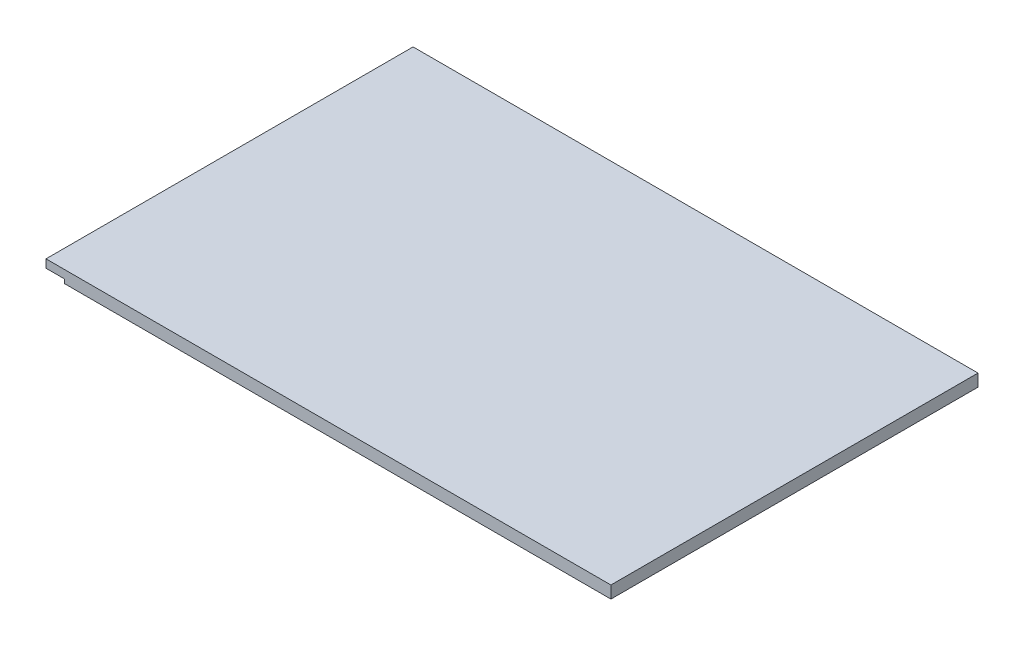
ISO-10303-21;
HEADER;
FILE_DESCRIPTION(('STEP AP214'),'2;1');
FILE_NAME('part.step','',(''),(''),'','','');
FILE_SCHEMA(('AUTOMOTIVE_DESIGN { 1 0 10303 214 1 1 1 1 }'));
ENDSEC;
DATA;
#1=APPLICATION_CONTEXT('core data for automotive mechanical design processes');
#2=APPLICATION_PROTOCOL_DEFINITION('international standard','automotive_design',2000,#1);
#3=PRODUCT_CONTEXT('',#1,'mechanical');
#4=PRODUCT('Part','Part','',(#3));
#5=PRODUCT_RELATED_PRODUCT_CATEGORY('part','',(#4));
#6=PRODUCT_DEFINITION_FORMATION('','',#4);
#7=PRODUCT_DEFINITION_CONTEXT('part definition',#1,'design');
#8=PRODUCT_DEFINITION('design','',#6,#7);
#9=PRODUCT_DEFINITION_SHAPE('','',#8);
#10=(LENGTH_UNIT() NAMED_UNIT(*) SI_UNIT(.MILLI.,.METRE.));
#11=(NAMED_UNIT(*) PLANE_ANGLE_UNIT() SI_UNIT($,.RADIAN.));
#12=(NAMED_UNIT(*) SI_UNIT($,.STERADIAN.) SOLID_ANGLE_UNIT());
#13=UNCERTAINTY_MEASURE_WITH_UNIT(LENGTH_MEASURE(1.E-05),#10,'distance_accuracy_value','');
#14=(GEOMETRIC_REPRESENTATION_CONTEXT(3) GLOBAL_UNCERTAINTY_ASSIGNED_CONTEXT((#13)) GLOBAL_UNIT_ASSIGNED_CONTEXT((#10,
#11,#12)) REPRESENTATION_CONTEXT('',''));
#15=CARTESIAN_POINT('',(0.,0.,0.));
#16=DIRECTION('',(0.,0.,1.));
#17=DIRECTION('',(1.,0.,0.));
#18=AXIS2_PLACEMENT_3D('',#15,#16,#17);
#19=CARTESIAN_POINT('',(-335.,7.5,225.));
#20=DIRECTION('',(1.,0.,0.));
#21=DIRECTION('',(0.,0.,-1.));
#22=AXIS2_PLACEMENT_3D('',#19,#20,#21);
#23=PLANE('',#22);
#24=DIRECTION('',(0.,-1.,0.));
#25=VECTOR('',#24,1.);
#26=CARTESIAN_POINT('',(-335.,7.5,225.));
#27=LINE('',#26,#25);
#28=CARTESIAN_POINT('',(-335.,-2.5,225.));
#29=VERTEX_POINT('',#28);
#30=CARTESIAN_POINT('',(-335.,-7.5,225.));
#31=VERTEX_POINT('',#30);
#32=EDGE_CURVE('E11',#29,#31,#27,.T.);
#33=ORIENTED_EDGE('',*,*,#32,.F.);
#34=DIRECTION('',(0.,0.,-1.));
#35=VECTOR('',#34,1.);
#36=CARTESIAN_POINT('',(-335.,-2.5,-225.));
#37=LINE('',#36,#35);
#38=CARTESIAN_POINT('',(-335.,-2.5,-225.));
#39=VERTEX_POINT('',#38);
#40=EDGE_CURVE('E90',#29,#39,#37,.T.);
#41=ORIENTED_EDGE('',*,*,#40,.T.);
#42=DIRECTION('',(0.,-1.,0.));
#43=VECTOR('',#42,1.);
#44=CARTESIAN_POINT('',(-335.,7.5,-225.));
#45=LINE('',#44,#43);
#46=CARTESIAN_POINT('',(-335.,-7.5,-225.));
#47=VERTEX_POINT('',#46);
#48=EDGE_CURVE('E85',#39,#47,#45,.T.);
#49=ORIENTED_EDGE('',*,*,#48,.T.);
#50=DIRECTION('',(0.,0.,1.));
#51=VECTOR('',#50,1.);
#52=CARTESIAN_POINT('',(-335.,-7.5,225.));
#53=LINE('',#52,#51);
#54=EDGE_CURVE('E89',#47,#31,#53,.T.);
#55=ORIENTED_EDGE('',*,*,#54,.T.);
#56=EDGE_LOOP('',(#33,#41,#49,#55));
#57=FACE_BOUND('',#56,.T.);
#58=ADVANCED_FACE('F43',(#57),#23,.F.);
#59=CARTESIAN_POINT('',(335.,7.5,225.));
#60=DIRECTION('',(0.,0.,-1.));
#61=DIRECTION('',(-1.,0.,0.));
#62=AXIS2_PLACEMENT_3D('',#59,#60,#61);
#63=PLANE('',#62);
#64=DIRECTION('',(1.,0.,0.));
#65=VECTOR('',#64,1.);
#66=CARTESIAN_POINT('',(335.,-7.5,225.));
#67=LINE('',#66,#65);
#68=CARTESIAN_POINT('',(335.,-7.5,225.));
#69=VERTEX_POINT('',#68);
#70=EDGE_CURVE('E109',#31,#69,#67,.T.);
#71=ORIENTED_EDGE('',*,*,#70,.T.);
#72=DIRECTION('',(0.,-1.,0.));
#73=VECTOR('',#72,1.);
#74=CARTESIAN_POINT('',(335.,7.5,225.));
#75=LINE('',#74,#73);
#76=CARTESIAN_POINT('',(335.,7.5,225.));
#77=VERTEX_POINT('',#76);
#78=EDGE_CURVE('E51',#77,#69,#75,.T.);
#79=ORIENTED_EDGE('',*,*,#78,.F.);
#80=DIRECTION('',(1.,0.,0.));
#81=VECTOR('',#80,1.);
#82=CARTESIAN_POINT('',(335.,7.5,225.));
#83=LINE('',#82,#81);
#84=CARTESIAN_POINT('',(-357.5,7.5,225.));
#85=VERTEX_POINT('',#84);
#86=EDGE_CURVE('E104',#85,#77,#83,.T.);
#87=ORIENTED_EDGE('',*,*,#86,.F.);
#88=DIRECTION('',(0.,1.,0.));
#89=VECTOR('',#88,1.);
#90=CARTESIAN_POINT('',(-357.5,-2.5,225.));
#91=LINE('',#90,#89);
#92=CARTESIAN_POINT('',(-357.5,-2.5,225.));
#93=VERTEX_POINT('',#92);
#94=EDGE_CURVE('E157',#93,#85,#91,.T.);
#95=ORIENTED_EDGE('',*,*,#94,.F.);
#96=DIRECTION('',(1.,0.,0.));
#97=VECTOR('',#96,1.);
#98=CARTESIAN_POINT('',(-335.,-2.5,225.));
#99=LINE('',#98,#97);
#100=EDGE_CURVE('E138',#93,#29,#99,.T.);
#101=ORIENTED_EDGE('',*,*,#100,.T.);
#102=ORIENTED_EDGE('',*,*,#32,.T.);
#103=EDGE_LOOP('',(#71,#79,#87,#95,#101,#102));
#104=FACE_BOUND('',#103,.T.);
#105=ADVANCED_FACE('F132',(#104),#63,.F.);
#106=CARTESIAN_POINT('',(335.,7.5,225.));
#107=DIRECTION('',(-1.,0.,0.));
#108=DIRECTION('',(0.,0.,1.));
#109=AXIS2_PLACEMENT_3D('',#106,#107,#108);
#110=PLANE('',#109);
#111=DIRECTION('',(0.,0.,-1.));
#112=VECTOR('',#111,1.);
#113=CARTESIAN_POINT('',(335.,-7.5,225.));
#114=LINE('',#113,#112);
#115=CARTESIAN_POINT('',(335.,-7.5,-225.));
#116=VERTEX_POINT('',#115);
#117=EDGE_CURVE('E105',#69,#116,#114,.T.);
#118=ORIENTED_EDGE('',*,*,#117,.T.);
#119=DIRECTION('',(0.,-1.,0.));
#120=VECTOR('',#119,1.);
#121=CARTESIAN_POINT('',(335.,7.5,-225.));
#122=LINE('',#121,#120);
#123=CARTESIAN_POINT('',(335.,7.5,-225.));
#124=VERTEX_POINT('',#123);
#125=EDGE_CURVE('E93',#124,#116,#122,.T.);
#126=ORIENTED_EDGE('',*,*,#125,.F.);
#127=DIRECTION('',(0.,0.,-1.));
#128=VECTOR('',#127,1.);
#129=CARTESIAN_POINT('',(335.,7.5,225.));
#130=LINE('',#129,#128);
#131=EDGE_CURVE('E67',#77,#124,#130,.T.);
#132=ORIENTED_EDGE('',*,*,#131,.F.);
#133=ORIENTED_EDGE('',*,*,#78,.T.);
#134=EDGE_LOOP('',(#118,#126,#132,#133));
#135=FACE_BOUND('',#134,.T.);
#136=ADVANCED_FACE('F129',(#135),#110,.F.);
#137=CARTESIAN_POINT('',(335.,7.5,-225.));
#138=DIRECTION('',(0.,0.,1.));
#139=DIRECTION('',(1.,0.,0.));
#140=AXIS2_PLACEMENT_3D('',#137,#138,#139);
#141=PLANE('',#140);
#142=DIRECTION('',(-1.,0.,0.));
#143=VECTOR('',#142,1.);
#144=CARTESIAN_POINT('',(335.,-7.5,-225.));
#145=LINE('',#144,#143);
#146=EDGE_CURVE('E98',#116,#47,#145,.T.);
#147=ORIENTED_EDGE('',*,*,#146,.T.);
#148=ORIENTED_EDGE('',*,*,#48,.F.);
#149=DIRECTION('',(-1.,0.,0.));
#150=VECTOR('',#149,1.);
#151=CARTESIAN_POINT('',(-335.,-2.5,-225.));
#152=LINE('',#151,#150);
#153=CARTESIAN_POINT('',(-357.5,-2.5,-225.));
#154=VERTEX_POINT('',#153);
#155=EDGE_CURVE('E58',#39,#154,#152,.T.);
#156=ORIENTED_EDGE('',*,*,#155,.T.);
#157=DIRECTION('',(0.,1.,0.));
#158=VECTOR('',#157,1.);
#159=CARTESIAN_POINT('',(-357.5,-2.5,-225.));
#160=LINE('',#159,#158);
#161=CARTESIAN_POINT('',(-357.5,7.5,-225.));
#162=VERTEX_POINT('',#161);
#163=EDGE_CURVE('E151',#154,#162,#160,.T.);
#164=ORIENTED_EDGE('',*,*,#163,.T.);
#165=DIRECTION('',(-1.,0.,0.));
#166=VECTOR('',#165,1.);
#167=CARTESIAN_POINT('',(335.,7.5,-225.));
#168=LINE('',#167,#166);
#169=EDGE_CURVE('E94',#124,#162,#168,.T.);
#170=ORIENTED_EDGE('',*,*,#169,.F.);
#171=ORIENTED_EDGE('',*,*,#125,.T.);
#172=EDGE_LOOP('',(#147,#148,#156,#164,#170,#171));
#173=FACE_BOUND('',#172,.T.);
#174=ADVANCED_FACE('F99',(#173),#141,.F.);
#175=CARTESIAN_POINT('',(0.,7.5,0.));
#176=DIRECTION('',(0.,1.,0.));
#177=DIRECTION('',(0.,0.,1.));
#178=AXIS2_PLACEMENT_3D('',#175,#176,#177);
#179=PLANE('',#178);
#180=ORIENTED_EDGE('',*,*,#169,.T.);
#181=DIRECTION('',(0.,0.,1.));
#182=VECTOR('',#181,1.);
#183=CARTESIAN_POINT('',(-357.5,7.5,-225.));
#184=LINE('',#183,#182);
#185=EDGE_CURVE('E155',#162,#85,#184,.T.);
#186=ORIENTED_EDGE('',*,*,#185,.T.);
#187=ORIENTED_EDGE('',*,*,#86,.T.);
#188=ORIENTED_EDGE('',*,*,#131,.T.);
#189=EDGE_LOOP('',(#180,#186,#187,#188));
#190=FACE_BOUND('',#189,.T.);
#191=ADVANCED_FACE('F269',(#190),#179,.T.);
#192=CARTESIAN_POINT('',(0.,-7.5,0.));
#193=DIRECTION('',(0.,1.,0.));
#194=DIRECTION('',(0.,0.,1.));
#195=AXIS2_PLACEMENT_3D('',#192,#193,#194);
#196=PLANE('',#195);
#197=CARTESIAN_POINT('',(-313.,-7.5,0.));
#198=DIRECTION('',(0.,-1.,0.));
#199=DIRECTION('',(0.,0.,-1.));
#200=AXIS2_PLACEMENT_3D('',#197,#198,#199);
#201=CIRCLE('',#200,2.50000000000002);
#202=CARTESIAN_POINT('',(-313.,-7.5,-2.50000000000002));
#203=VERTEX_POINT('',#202);
#204=EDGE_CURVE('E769',#203,#203,#201,.T.);
#205=ORIENTED_EDGE('',*,*,#204,.F.);
#206=EDGE_LOOP('',(#205));
#207=FACE_BOUND('',#206,.T.);
#208=CARTESIAN_POINT('',(-328.,-7.5,-20.));
#209=DIRECTION('',(0.,-1.,0.));
#210=DIRECTION('',(0.,0.,-1.));
#211=AXIS2_PLACEMENT_3D('',#208,#209,#210);
#212=CIRCLE('',#211,2.50000000000002);
#213=CARTESIAN_POINT('',(-328.,-7.5,-22.5));
#214=VERTEX_POINT('',#213);
#215=EDGE_CURVE('E773',#214,#214,#212,.T.);
#216=ORIENTED_EDGE('',*,*,#215,.F.);
#217=EDGE_LOOP('',(#216));
#218=FACE_BOUND('',#217,.T.);
#219=CARTESIAN_POINT('',(-328.,-7.5,20.));
#220=DIRECTION('',(0.,-1.,0.));
#221=DIRECTION('',(0.,0.,-1.));
#222=AXIS2_PLACEMENT_3D('',#219,#220,#221);
#223=CIRCLE('',#222,2.50000000000002);
#224=CARTESIAN_POINT('',(-328.,-7.5,17.5));
#225=VERTEX_POINT('',#224);
#226=EDGE_CURVE('E783',#225,#225,#223,.T.);
#227=ORIENTED_EDGE('',*,*,#226,.F.);
#228=EDGE_LOOP('',(#227));
#229=FACE_BOUND('',#228,.T.);
#230=CARTESIAN_POINT('',(-328.,-7.5,-110.));
#231=DIRECTION('',(0.,-1.,0.));
#232=DIRECTION('',(0.,0.,-1.));
#233=AXIS2_PLACEMENT_3D('',#230,#231,#232);
#234=CIRCLE('',#233,2.50000000000002);
#235=CARTESIAN_POINT('',(-328.,-7.5,-112.5));
#236=VERTEX_POINT('',#235);
#237=EDGE_CURVE('E180',#236,#236,#234,.T.);
#238=ORIENTED_EDGE('',*,*,#237,.F.);
#239=EDGE_LOOP('',(#238));
#240=FACE_BOUND('',#239,.T.);
#241=CARTESIAN_POINT('',(-313.,-7.5,-130.));
#242=DIRECTION('',(0.,-1.,0.));
#243=DIRECTION('',(0.,0.,-1.));
#244=AXIS2_PLACEMENT_3D('',#241,#242,#243);
#245=CIRCLE('',#244,2.50000000000002);
#246=CARTESIAN_POINT('',(-313.,-7.5,-132.5));
#247=VERTEX_POINT('',#246);
#248=EDGE_CURVE('E188',#247,#247,#245,.T.);
#249=ORIENTED_EDGE('',*,*,#248,.F.);
#250=EDGE_LOOP('',(#249));
#251=FACE_BOUND('',#250,.T.);
#252=CARTESIAN_POINT('',(-328.,-7.5,150.));
#253=DIRECTION('',(0.,-1.,0.));
#254=DIRECTION('',(0.,0.,1.));
#255=AXIS2_PLACEMENT_3D('',#252,#253,#254);
#256=CIRCLE('',#255,2.50000000000002);
#257=CARTESIAN_POINT('',(-328.,-7.5,152.5));
#258=VERTEX_POINT('',#257);
#259=EDGE_CURVE('E196',#258,#258,#256,.T.);
#260=ORIENTED_EDGE('',*,*,#259,.F.);
#261=EDGE_LOOP('',(#260));
#262=FACE_BOUND('',#261,.T.);
#263=CARTESIAN_POINT('',(-313.,-7.5,130.));
#264=DIRECTION('',(0.,-1.,0.));
#265=DIRECTION('',(0.,0.,1.));
#266=AXIS2_PLACEMENT_3D('',#263,#264,#265);
#267=CIRCLE('',#266,2.50000000000002);
#268=CARTESIAN_POINT('',(-313.,-7.5,132.5));
#269=VERTEX_POINT('',#268);
#270=EDGE_CURVE('E204',#269,#269,#267,.T.);
#271=ORIENTED_EDGE('',*,*,#270,.F.);
#272=EDGE_LOOP('',(#271));
#273=FACE_BOUND('',#272,.T.);
#274=CARTESIAN_POINT('',(-328.,-7.5,110.));
#275=DIRECTION('',(0.,-1.,0.));
#276=DIRECTION('',(0.,0.,1.));
#277=AXIS2_PLACEMENT_3D('',#274,#275,#276);
#278=CIRCLE('',#277,2.50000000000002);
#279=CARTESIAN_POINT('',(-328.,-7.5,112.5));
#280=VERTEX_POINT('',#279);
#281=EDGE_CURVE('E212',#280,#280,#278,.T.);
#282=ORIENTED_EDGE('',*,*,#281,.F.);
#283=EDGE_LOOP('',(#282));
#284=FACE_BOUND('',#283,.T.);
#285=CARTESIAN_POINT('',(328.,-7.5,150.));
#286=DIRECTION('',(0.,-1.,0.));
#287=DIRECTION('',(0.,0.,-1.));
#288=AXIS2_PLACEMENT_3D('',#285,#286,#287);
#289=CIRCLE('',#288,2.50000000000002);
#290=CARTESIAN_POINT('',(328.,-7.5,147.5));
#291=VERTEX_POINT('',#290);
#292=EDGE_CURVE('E220',#291,#291,#289,.T.);
#293=ORIENTED_EDGE('',*,*,#292,.F.);
#294=EDGE_LOOP('',(#293));
#295=FACE_BOUND('',#294,.T.);
#296=CARTESIAN_POINT('',(328.,-7.5,110.));
#297=DIRECTION('',(0.,-1.,0.));
#298=DIRECTION('',(0.,0.,-1.));
#299=AXIS2_PLACEMENT_3D('',#296,#297,#298);
#300=CIRCLE('',#299,2.50000000000002);
#301=CARTESIAN_POINT('',(328.,-7.5,107.5));
#302=VERTEX_POINT('',#301);
#303=EDGE_CURVE('E228',#302,#302,#300,.T.);
#304=ORIENTED_EDGE('',*,*,#303,.F.);
#305=EDGE_LOOP('',(#304));
#306=FACE_BOUND('',#305,.T.);
#307=CARTESIAN_POINT('',(313.,-7.5,130.));
#308=DIRECTION('',(0.,-1.,0.));
#309=DIRECTION('',(0.,0.,-1.));
#310=AXIS2_PLACEMENT_3D('',#307,#308,#309);
#311=CIRCLE('',#310,2.50000000000002);
#312=CARTESIAN_POINT('',(313.,-7.5,127.5));
#313=VERTEX_POINT('',#312);
#314=EDGE_CURVE('E236',#313,#313,#311,.T.);
#315=ORIENTED_EDGE('',*,*,#314,.F.);
#316=EDGE_LOOP('',(#315));
#317=FACE_BOUND('',#316,.T.);
#318=CARTESIAN_POINT('',(328.,-7.5,-150.));
#319=DIRECTION('',(0.,-1.,0.));
#320=DIRECTION('',(0.,0.,1.));
#321=AXIS2_PLACEMENT_3D('',#318,#319,#320);
#322=CIRCLE('',#321,2.50000000000002);
#323=CARTESIAN_POINT('',(328.,-7.5,-147.5));
#324=VERTEX_POINT('',#323);
#325=EDGE_CURVE('E244',#324,#324,#322,.T.);
#326=ORIENTED_EDGE('',*,*,#325,.F.);
#327=EDGE_LOOP('',(#326));
#328=FACE_BOUND('',#327,.T.);
#329=CARTESIAN_POINT('',(313.,-7.5,-130.));
#330=DIRECTION('',(0.,-1.,0.));
#331=DIRECTION('',(0.,0.,1.));
#332=AXIS2_PLACEMENT_3D('',#329,#330,#331);
#333=CIRCLE('',#332,2.50000000000002);
#334=CARTESIAN_POINT('',(313.,-7.5,-127.5));
#335=VERTEX_POINT('',#334);
#336=EDGE_CURVE('E252',#335,#335,#333,.T.);
#337=ORIENTED_EDGE('',*,*,#336,.F.);
#338=EDGE_LOOP('',(#337));
#339=FACE_BOUND('',#338,.T.);
#340=CARTESIAN_POINT('',(328.,-7.5,-110.));
#341=DIRECTION('',(0.,-1.,0.));
#342=DIRECTION('',(0.,0.,1.));
#343=AXIS2_PLACEMENT_3D('',#340,#341,#342);
#344=CIRCLE('',#343,2.50000000000002);
#345=CARTESIAN_POINT('',(328.,-7.5,-107.5));
#346=VERTEX_POINT('',#345);
#347=EDGE_CURVE('E174',#346,#346,#344,.T.);
#348=ORIENTED_EDGE('',*,*,#347,.F.);
#349=EDGE_LOOP('',(#348));
#350=FACE_BOUND('',#349,.T.);
#351=CARTESIAN_POINT('',(-328.,-7.5,-150.));
#352=DIRECTION('',(0.,-1.,0.));
#353=DIRECTION('',(0.,0.,-1.));
#354=AXIS2_PLACEMENT_3D('',#351,#352,#353);
#355=CIRCLE('',#354,2.50000000000002);
#356=CARTESIAN_POINT('',(-328.,-7.5,-152.5));
#357=VERTEX_POINT('',#356);
#358=EDGE_CURVE('E117',#357,#357,#355,.T.);
#359=ORIENTED_EDGE('',*,*,#358,.F.);
#360=EDGE_LOOP('',(#359));
#361=FACE_BOUND('',#360,.T.);
#362=ORIENTED_EDGE('',*,*,#54,.F.);
#363=ORIENTED_EDGE('',*,*,#146,.F.);
#364=ORIENTED_EDGE('',*,*,#117,.F.);
#365=ORIENTED_EDGE('',*,*,#70,.F.);
#366=EDGE_LOOP('',(#362,#363,#364,#365));
#367=FACE_BOUND('',#366,.T.);
#368=ADVANCED_FACE('F108',(#207,#218,#229,#240,#251,#262,#273,#284,#295,#306,#317,#328,#339,
#350,#361,#367),#196,.F.);
#369=CARTESIAN_POINT('',(-328.,2.5,-150.));
#370=DIRECTION('',(0.,-1.,0.));
#371=DIRECTION('',(0.,0.,-1.));
#372=AXIS2_PLACEMENT_3D('',#369,#370,#371);
#373=CYLINDRICAL_SURFACE('',#372,2.50000000000002);
#374=CARTESIAN_POINT('',(-328.,2.5,-150.));
#375=DIRECTION('',(0.,-1.,0.));
#376=DIRECTION('',(0.,0.,-1.));
#377=AXIS2_PLACEMENT_3D('',#374,#375,#376);
#378=CIRCLE('',#377,2.50000000000002);
#379=CARTESIAN_POINT('',(-328.,2.5,-152.5));
#380=VERTEX_POINT('',#379);
#381=EDGE_CURVE('E111',#380,#380,#378,.T.);
#382=ORIENTED_EDGE('',*,*,#381,.F.);
#383=EDGE_LOOP('',(#382));
#384=FACE_BOUND('',#383,.T.);
#385=ORIENTED_EDGE('',*,*,#358,.T.);
#386=EDGE_LOOP('',(#385));
#387=FACE_BOUND('',#386,.T.);
#388=ADVANCED_FACE('F276',(#384,#387),#373,.F.);
#389=CARTESIAN_POINT('',(-328.,2.5,-150.));
#390=DIRECTION('',(0.,-1.,0.));
#391=DIRECTION('',(0.,0.,-1.));
#392=AXIS2_PLACEMENT_3D('',#389,#390,#391);
#393=PLANE('',#392);
#394=ORIENTED_EDGE('',*,*,#381,.T.);
#395=EDGE_LOOP('',(#394));
#396=FACE_BOUND('',#395,.T.);
#397=ADVANCED_FACE('F625',(#396),#393,.T.);
#398=CARTESIAN_POINT('',(328.,2.5,-110.));
#399=DIRECTION('',(0.,-1.,0.));
#400=DIRECTION('',(0.,0.,-1.));
#401=AXIS2_PLACEMENT_3D('',#398,#399,#400);
#402=CYLINDRICAL_SURFACE('',#401,2.50000000000002);
#403=CARTESIAN_POINT('',(328.,2.5,-110.));
#404=DIRECTION('',(0.,-1.,0.));
#405=DIRECTION('',(0.,0.,1.));
#406=AXIS2_PLACEMENT_3D('',#403,#404,#405);
#407=CIRCLE('',#406,2.50000000000002);
#408=CARTESIAN_POINT('',(328.,2.5,-107.5));
#409=VERTEX_POINT('',#408);
#410=EDGE_CURVE('E256',#409,#409,#407,.T.);
#411=ORIENTED_EDGE('',*,*,#410,.F.);
#412=EDGE_LOOP('',(#411));
#413=FACE_BOUND('',#412,.T.);
#414=ORIENTED_EDGE('',*,*,#347,.T.);
#415=EDGE_LOOP('',(#414));
#416=FACE_BOUND('',#415,.T.);
#417=ADVANCED_FACE('F615',(#413,#416),#402,.F.);
#418=CARTESIAN_POINT('',(328.,2.5,-110.));
#419=DIRECTION('',(0.,1.,0.));
#420=DIRECTION('',(0.,0.,1.));
#421=AXIS2_PLACEMENT_3D('',#418,#419,#420);
#422=PLANE('',#421);
#423=ORIENTED_EDGE('',*,*,#410,.T.);
#424=EDGE_LOOP('',(#423));
#425=FACE_BOUND('',#424,.T.);
#426=ADVANCED_FACE('F605',(#425),#422,.F.);
#427=CARTESIAN_POINT('',(313.,2.5,-130.));
#428=DIRECTION('',(0.,-1.,0.));
#429=DIRECTION('',(0.,0.,-1.));
#430=AXIS2_PLACEMENT_3D('',#427,#428,#429);
#431=CYLINDRICAL_SURFACE('',#430,2.50000000000002);
#432=CARTESIAN_POINT('',(313.,2.5,-130.));
#433=DIRECTION('',(0.,-1.,0.));
#434=DIRECTION('',(0.,0.,1.));
#435=AXIS2_PLACEMENT_3D('',#432,#433,#434);
#436=CIRCLE('',#435,2.50000000000002);
#437=CARTESIAN_POINT('',(313.,2.5,-127.5));
#438=VERTEX_POINT('',#437);
#439=EDGE_CURVE('E248',#438,#438,#436,.T.);
#440=ORIENTED_EDGE('',*,*,#439,.F.);
#441=EDGE_LOOP('',(#440));
#442=FACE_BOUND('',#441,.T.);
#443=ORIENTED_EDGE('',*,*,#336,.T.);
#444=EDGE_LOOP('',(#443));
#445=FACE_BOUND('',#444,.T.);
#446=ADVANCED_FACE('F595',(#442,#445),#431,.F.);
#447=CARTESIAN_POINT('',(313.,2.5,-130.));
#448=DIRECTION('',(0.,1.,0.));
#449=DIRECTION('',(0.,0.,1.));
#450=AXIS2_PLACEMENT_3D('',#447,#448,#449);
#451=PLANE('',#450);
#452=ORIENTED_EDGE('',*,*,#439,.T.);
#453=EDGE_LOOP('',(#452));
#454=FACE_BOUND('',#453,.T.);
#455=ADVANCED_FACE('F585',(#454),#451,.F.);
#456=CARTESIAN_POINT('',(328.,2.5,-150.));
#457=DIRECTION('',(0.,-1.,0.));
#458=DIRECTION('',(0.,0.,-1.));
#459=AXIS2_PLACEMENT_3D('',#456,#457,#458);
#460=CYLINDRICAL_SURFACE('',#459,2.50000000000002);
#461=CARTESIAN_POINT('',(328.,2.5,-150.));
#462=DIRECTION('',(0.,-1.,0.));
#463=DIRECTION('',(0.,0.,1.));
#464=AXIS2_PLACEMENT_3D('',#461,#462,#463);
#465=CIRCLE('',#464,2.50000000000002);
#466=CARTESIAN_POINT('',(328.,2.5,-147.5));
#467=VERTEX_POINT('',#466);
#468=EDGE_CURVE('E240',#467,#467,#465,.T.);
#469=ORIENTED_EDGE('',*,*,#468,.F.);
#470=EDGE_LOOP('',(#469));
#471=FACE_BOUND('',#470,.T.);
#472=ORIENTED_EDGE('',*,*,#325,.T.);
#473=EDGE_LOOP('',(#472));
#474=FACE_BOUND('',#473,.T.);
#475=ADVANCED_FACE('F575',(#471,#474),#460,.F.);
#476=CARTESIAN_POINT('',(328.,2.5,-150.));
#477=DIRECTION('',(0.,1.,0.));
#478=DIRECTION('',(0.,0.,1.));
#479=AXIS2_PLACEMENT_3D('',#476,#477,#478);
#480=PLANE('',#479);
#481=ORIENTED_EDGE('',*,*,#468,.T.);
#482=EDGE_LOOP('',(#481));
#483=FACE_BOUND('',#482,.T.);
#484=ADVANCED_FACE('F565',(#483),#480,.F.);
#485=CARTESIAN_POINT('',(313.,2.5,130.));
#486=DIRECTION('',(0.,-1.,0.));
#487=DIRECTION('',(0.,0.,-1.));
#488=AXIS2_PLACEMENT_3D('',#485,#486,#487);
#489=CYLINDRICAL_SURFACE('',#488,2.50000000000002);
#490=CARTESIAN_POINT('',(313.,2.5,130.));
#491=DIRECTION('',(0.,-1.,0.));
#492=DIRECTION('',(0.,0.,-1.));
#493=AXIS2_PLACEMENT_3D('',#490,#491,#492);
#494=CIRCLE('',#493,2.50000000000002);
#495=CARTESIAN_POINT('',(313.,2.5,127.5));
#496=VERTEX_POINT('',#495);
#497=EDGE_CURVE('E232',#496,#496,#494,.T.);
#498=ORIENTED_EDGE('',*,*,#497,.F.);
#499=EDGE_LOOP('',(#498));
#500=FACE_BOUND('',#499,.T.);
#501=ORIENTED_EDGE('',*,*,#314,.T.);
#502=EDGE_LOOP('',(#501));
#503=FACE_BOUND('',#502,.T.);
#504=ADVANCED_FACE('F555',(#500,#503),#489,.F.);
#505=CARTESIAN_POINT('',(313.,2.5,130.));
#506=DIRECTION('',(0.,-1.,0.));
#507=DIRECTION('',(0.,0.,-1.));
#508=AXIS2_PLACEMENT_3D('',#505,#506,#507);
#509=PLANE('',#508);
#510=ORIENTED_EDGE('',*,*,#497,.T.);
#511=EDGE_LOOP('',(#510));
#512=FACE_BOUND('',#511,.T.);
#513=ADVANCED_FACE('F545',(#512),#509,.T.);
#514=CARTESIAN_POINT('',(328.,2.5,110.));
#515=DIRECTION('',(0.,-1.,0.));
#516=DIRECTION('',(0.,0.,-1.));
#517=AXIS2_PLACEMENT_3D('',#514,#515,#516);
#518=CYLINDRICAL_SURFACE('',#517,2.50000000000002);
#519=CARTESIAN_POINT('',(328.,2.5,110.));
#520=DIRECTION('',(0.,-1.,0.));
#521=DIRECTION('',(0.,0.,-1.));
#522=AXIS2_PLACEMENT_3D('',#519,#520,#521);
#523=CIRCLE('',#522,2.50000000000002);
#524=CARTESIAN_POINT('',(328.,2.5,107.5));
#525=VERTEX_POINT('',#524);
#526=EDGE_CURVE('E224',#525,#525,#523,.T.);
#527=ORIENTED_EDGE('',*,*,#526,.F.);
#528=EDGE_LOOP('',(#527));
#529=FACE_BOUND('',#528,.T.);
#530=ORIENTED_EDGE('',*,*,#303,.T.);
#531=EDGE_LOOP('',(#530));
#532=FACE_BOUND('',#531,.T.);
#533=ADVANCED_FACE('F535',(#529,#532),#518,.F.);
#534=CARTESIAN_POINT('',(328.,2.5,110.));
#535=DIRECTION('',(0.,-1.,0.));
#536=DIRECTION('',(0.,0.,-1.));
#537=AXIS2_PLACEMENT_3D('',#534,#535,#536);
#538=PLANE('',#537);
#539=ORIENTED_EDGE('',*,*,#526,.T.);
#540=EDGE_LOOP('',(#539));
#541=FACE_BOUND('',#540,.T.);
#542=ADVANCED_FACE('F525',(#541),#538,.T.);
#543=CARTESIAN_POINT('',(328.,2.5,150.));
#544=DIRECTION('',(0.,-1.,0.));
#545=DIRECTION('',(0.,0.,-1.));
#546=AXIS2_PLACEMENT_3D('',#543,#544,#545);
#547=CYLINDRICAL_SURFACE('',#546,2.50000000000002);
#548=CARTESIAN_POINT('',(328.,2.5,150.));
#549=DIRECTION('',(0.,-1.,0.));
#550=DIRECTION('',(0.,0.,-1.));
#551=AXIS2_PLACEMENT_3D('',#548,#549,#550);
#552=CIRCLE('',#551,2.50000000000002);
#553=CARTESIAN_POINT('',(328.,2.5,147.5));
#554=VERTEX_POINT('',#553);
#555=EDGE_CURVE('E216',#554,#554,#552,.T.);
#556=ORIENTED_EDGE('',*,*,#555,.F.);
#557=EDGE_LOOP('',(#556));
#558=FACE_BOUND('',#557,.T.);
#559=ORIENTED_EDGE('',*,*,#292,.T.);
#560=EDGE_LOOP('',(#559));
#561=FACE_BOUND('',#560,.T.);
#562=ADVANCED_FACE('F515',(#558,#561),#547,.F.);
#563=CARTESIAN_POINT('',(328.,2.5,150.));
#564=DIRECTION('',(0.,-1.,0.));
#565=DIRECTION('',(0.,0.,-1.));
#566=AXIS2_PLACEMENT_3D('',#563,#564,#565);
#567=PLANE('',#566);
#568=ORIENTED_EDGE('',*,*,#555,.T.);
#569=EDGE_LOOP('',(#568));
#570=FACE_BOUND('',#569,.T.);
#571=ADVANCED_FACE('F505',(#570),#567,.T.);
#572=CARTESIAN_POINT('',(-328.,2.5,110.));
#573=DIRECTION('',(0.,-1.,0.));
#574=DIRECTION('',(0.,0.,-1.));
#575=AXIS2_PLACEMENT_3D('',#572,#573,#574);
#576=CYLINDRICAL_SURFACE('',#575,2.50000000000002);
#577=CARTESIAN_POINT('',(-328.,2.5,110.));
#578=DIRECTION('',(0.,-1.,0.));
#579=DIRECTION('',(0.,0.,1.));
#580=AXIS2_PLACEMENT_3D('',#577,#578,#579);
#581=CIRCLE('',#580,2.50000000000002);
#582=CARTESIAN_POINT('',(-328.,2.5,112.5));
#583=VERTEX_POINT('',#582);
#584=EDGE_CURVE('E208',#583,#583,#581,.T.);
#585=ORIENTED_EDGE('',*,*,#584,.F.);
#586=EDGE_LOOP('',(#585));
#587=FACE_BOUND('',#586,.T.);
#588=ORIENTED_EDGE('',*,*,#281,.T.);
#589=EDGE_LOOP('',(#588));
#590=FACE_BOUND('',#589,.T.);
#591=ADVANCED_FACE('F495',(#587,#590),#576,.F.);
#592=CARTESIAN_POINT('',(-328.,2.5,110.));
#593=DIRECTION('',(0.,1.,0.));
#594=DIRECTION('',(0.,0.,1.));
#595=AXIS2_PLACEMENT_3D('',#592,#593,#594);
#596=PLANE('',#595);
#597=ORIENTED_EDGE('',*,*,#584,.T.);
#598=EDGE_LOOP('',(#597));
#599=FACE_BOUND('',#598,.T.);
#600=ADVANCED_FACE('F485',(#599),#596,.F.);
#601=CARTESIAN_POINT('',(-313.,2.5,130.));
#602=DIRECTION('',(0.,-1.,0.));
#603=DIRECTION('',(0.,0.,-1.));
#604=AXIS2_PLACEMENT_3D('',#601,#602,#603);
#605=CYLINDRICAL_SURFACE('',#604,2.50000000000002);
#606=CARTESIAN_POINT('',(-313.,2.5,130.));
#607=DIRECTION('',(0.,-1.,0.));
#608=DIRECTION('',(0.,0.,1.));
#609=AXIS2_PLACEMENT_3D('',#606,#607,#608);
#610=CIRCLE('',#609,2.50000000000002);
#611=CARTESIAN_POINT('',(-313.,2.5,132.5));
#612=VERTEX_POINT('',#611);
#613=EDGE_CURVE('E200',#612,#612,#610,.T.);
#614=ORIENTED_EDGE('',*,*,#613,.F.);
#615=EDGE_LOOP('',(#614));
#616=FACE_BOUND('',#615,.T.);
#617=ORIENTED_EDGE('',*,*,#270,.T.);
#618=EDGE_LOOP('',(#617));
#619=FACE_BOUND('',#618,.T.);
#620=ADVANCED_FACE('F475',(#616,#619),#605,.F.);
#621=CARTESIAN_POINT('',(-313.,2.5,130.));
#622=DIRECTION('',(0.,1.,0.));
#623=DIRECTION('',(0.,0.,1.));
#624=AXIS2_PLACEMENT_3D('',#621,#622,#623);
#625=PLANE('',#624);
#626=ORIENTED_EDGE('',*,*,#613,.T.);
#627=EDGE_LOOP('',(#626));
#628=FACE_BOUND('',#627,.T.);
#629=ADVANCED_FACE('F465',(#628),#625,.F.);
#630=CARTESIAN_POINT('',(-328.,2.5,150.));
#631=DIRECTION('',(0.,-1.,0.));
#632=DIRECTION('',(0.,0.,-1.));
#633=AXIS2_PLACEMENT_3D('',#630,#631,#632);
#634=CYLINDRICAL_SURFACE('',#633,2.50000000000002);
#635=CARTESIAN_POINT('',(-328.,2.5,150.));
#636=DIRECTION('',(0.,-1.,0.));
#637=DIRECTION('',(0.,0.,1.));
#638=AXIS2_PLACEMENT_3D('',#635,#636,#637);
#639=CIRCLE('',#638,2.50000000000002);
#640=CARTESIAN_POINT('',(-328.,2.5,152.5));
#641=VERTEX_POINT('',#640);
#642=EDGE_CURVE('E192',#641,#641,#639,.T.);
#643=ORIENTED_EDGE('',*,*,#642,.F.);
#644=EDGE_LOOP('',(#643));
#645=FACE_BOUND('',#644,.T.);
#646=ORIENTED_EDGE('',*,*,#259,.T.);
#647=EDGE_LOOP('',(#646));
#648=FACE_BOUND('',#647,.T.);
#649=ADVANCED_FACE('F455',(#645,#648),#634,.F.);
#650=CARTESIAN_POINT('',(-328.,2.5,150.));
#651=DIRECTION('',(0.,1.,0.));
#652=DIRECTION('',(0.,0.,1.));
#653=AXIS2_PLACEMENT_3D('',#650,#651,#652);
#654=PLANE('',#653);
#655=ORIENTED_EDGE('',*,*,#642,.T.);
#656=EDGE_LOOP('',(#655));
#657=FACE_BOUND('',#656,.T.);
#658=ADVANCED_FACE('F445',(#657),#654,.F.);
#659=CARTESIAN_POINT('',(-313.,2.5,-130.));
#660=DIRECTION('',(0.,-1.,0.));
#661=DIRECTION('',(0.,0.,-1.));
#662=AXIS2_PLACEMENT_3D('',#659,#660,#661);
#663=CYLINDRICAL_SURFACE('',#662,2.50000000000002);
#664=CARTESIAN_POINT('',(-313.,2.5,-130.));
#665=DIRECTION('',(0.,-1.,0.));
#666=DIRECTION('',(0.,0.,-1.));
#667=AXIS2_PLACEMENT_3D('',#664,#665,#666);
#668=CIRCLE('',#667,2.50000000000002);
#669=CARTESIAN_POINT('',(-313.,2.5,-132.5));
#670=VERTEX_POINT('',#669);
#671=EDGE_CURVE('E184',#670,#670,#668,.T.);
#672=ORIENTED_EDGE('',*,*,#671,.F.);
#673=EDGE_LOOP('',(#672));
#674=FACE_BOUND('',#673,.T.);
#675=ORIENTED_EDGE('',*,*,#248,.T.);
#676=EDGE_LOOP('',(#675));
#677=FACE_BOUND('',#676,.T.);
#678=ADVANCED_FACE('F435',(#674,#677),#663,.F.);
#679=CARTESIAN_POINT('',(-313.,2.5,-130.));
#680=DIRECTION('',(0.,-1.,0.));
#681=DIRECTION('',(0.,0.,-1.));
#682=AXIS2_PLACEMENT_3D('',#679,#680,#681);
#683=PLANE('',#682);
#684=ORIENTED_EDGE('',*,*,#671,.T.);
#685=EDGE_LOOP('',(#684));
#686=FACE_BOUND('',#685,.T.);
#687=ADVANCED_FACE('F425',(#686),#683,.T.);
#688=CARTESIAN_POINT('',(-328.,2.5,-110.));
#689=DIRECTION('',(0.,-1.,0.));
#690=DIRECTION('',(0.,0.,-1.));
#691=AXIS2_PLACEMENT_3D('',#688,#689,#690);
#692=CYLINDRICAL_SURFACE('',#691,2.50000000000002);
#693=CARTESIAN_POINT('',(-328.,2.5,-110.));
#694=DIRECTION('',(0.,-1.,0.));
#695=DIRECTION('',(0.,0.,-1.));
#696=AXIS2_PLACEMENT_3D('',#693,#694,#695);
#697=CIRCLE('',#696,2.50000000000002);
#698=CARTESIAN_POINT('',(-328.,2.5,-112.5));
#699=VERTEX_POINT('',#698);
#700=EDGE_CURVE('E176',#699,#699,#697,.T.);
#701=ORIENTED_EDGE('',*,*,#700,.F.);
#702=EDGE_LOOP('',(#701));
#703=FACE_BOUND('',#702,.T.);
#704=ORIENTED_EDGE('',*,*,#237,.T.);
#705=EDGE_LOOP('',(#704));
#706=FACE_BOUND('',#705,.T.);
#707=ADVANCED_FACE('F415',(#703,#706),#692,.F.);
#708=CARTESIAN_POINT('',(-328.,2.5,-110.));
#709=DIRECTION('',(0.,-1.,0.));
#710=DIRECTION('',(0.,0.,-1.));
#711=AXIS2_PLACEMENT_3D('',#708,#709,#710);
#712=PLANE('',#711);
#713=ORIENTED_EDGE('',*,*,#700,.T.);
#714=EDGE_LOOP('',(#713));
#715=FACE_BOUND('',#714,.T.);
#716=ADVANCED_FACE('F313',(#715),#712,.T.);
#717=CARTESIAN_POINT('',(-357.5,-2.5,-225.));
#718=DIRECTION('',(-1.,0.,0.));
#719=DIRECTION('',(0.,0.,1.));
#720=AXIS2_PLACEMENT_3D('',#717,#718,#719);
#721=PLANE('',#720);
#722=ORIENTED_EDGE('',*,*,#185,.F.);
#723=ORIENTED_EDGE('',*,*,#163,.F.);
#724=DIRECTION('',(0.,0.,1.));
#725=VECTOR('',#724,1.);
#726=CARTESIAN_POINT('',(-357.5,-2.5,-225.));
#727=LINE('',#726,#725);
#728=EDGE_CURVE('E153',#154,#93,#727,.T.);
#729=ORIENTED_EDGE('',*,*,#728,.T.);
#730=ORIENTED_EDGE('',*,*,#94,.T.);
#731=EDGE_LOOP('',(#722,#723,#729,#730));
#732=FACE_BOUND('',#731,.T.);
#733=ADVANCED_FACE('F152',(#732),#721,.T.);
#734=CARTESIAN_POINT('',(0.,-2.5,0.));
#735=DIRECTION('',(0.,-1.,0.));
#736=DIRECTION('',(0.,0.,-1.));
#737=AXIS2_PLACEMENT_3D('',#734,#735,#736);
#738=PLANE('',#737);
#739=ORIENTED_EDGE('',*,*,#40,.F.);
#740=ORIENTED_EDGE('',*,*,#100,.F.);
#741=ORIENTED_EDGE('',*,*,#728,.F.);
#742=ORIENTED_EDGE('',*,*,#155,.F.);
#743=EDGE_LOOP('',(#739,#740,#741,#742));
#744=FACE_BOUND('',#743,.T.);
#745=ADVANCED_FACE('F159',(#744),#738,.T.);
#746=CARTESIAN_POINT('',(-328.,2.5,20.));
#747=DIRECTION('',(0.,-1.,0.));
#748=DIRECTION('',(0.,0.,-1.));
#749=AXIS2_PLACEMENT_3D('',#746,#747,#748);
#750=CYLINDRICAL_SURFACE('',#749,2.50000000000002);
#751=CARTESIAN_POINT('',(-328.,2.5,20.));
#752=DIRECTION('',(0.,-1.,0.));
#753=DIRECTION('',(0.,0.,-1.));
#754=AXIS2_PLACEMENT_3D('',#751,#752,#753);
#755=CIRCLE('',#754,2.50000000000002);
#756=CARTESIAN_POINT('',(-328.,2.5,17.5));
#757=VERTEX_POINT('',#756);
#758=EDGE_CURVE('E786',#757,#757,#755,.T.);
#759=ORIENTED_EDGE('',*,*,#758,.F.);
#760=EDGE_LOOP('',(#759));
#761=FACE_BOUND('',#760,.T.);
#762=ORIENTED_EDGE('',*,*,#226,.T.);
#763=EDGE_LOOP('',(#762));
#764=FACE_BOUND('',#763,.T.);
#765=ADVANCED_FACE('F324',(#761,#764),#750,.F.);
#766=CARTESIAN_POINT('',(-328.,2.5,20.));
#767=DIRECTION('',(0.,-1.,0.));
#768=DIRECTION('',(0.,0.,-1.));
#769=AXIS2_PLACEMENT_3D('',#766,#767,#768);
#770=PLANE('',#769);
#771=ORIENTED_EDGE('',*,*,#758,.T.);
#772=EDGE_LOOP('',(#771));
#773=FACE_BOUND('',#772,.T.);
#774=ADVANCED_FACE('F343',(#773),#770,.T.);
#775=CARTESIAN_POINT('',(-328.,2.5,-20.));
#776=DIRECTION('',(0.,-1.,0.));
#777=DIRECTION('',(0.,0.,-1.));
#778=AXIS2_PLACEMENT_3D('',#775,#776,#777);
#779=CYLINDRICAL_SURFACE('',#778,2.50000000000002);
#780=CARTESIAN_POINT('',(-328.,2.5,-20.));
#781=DIRECTION('',(0.,-1.,0.));
#782=DIRECTION('',(0.,0.,-1.));
#783=AXIS2_PLACEMENT_3D('',#780,#781,#782);
#784=CIRCLE('',#783,2.50000000000002);
#785=CARTESIAN_POINT('',(-328.,2.5,-22.5));
#786=VERTEX_POINT('',#785);
#787=EDGE_CURVE('E779',#786,#786,#784,.T.);
#788=ORIENTED_EDGE('',*,*,#787,.F.);
#789=EDGE_LOOP('',(#788));
#790=FACE_BOUND('',#789,.T.);
#791=ORIENTED_EDGE('',*,*,#215,.T.);
#792=EDGE_LOOP('',(#791));
#793=FACE_BOUND('',#792,.T.);
#794=ADVANCED_FACE('F354',(#790,#793),#779,.F.);
#795=CARTESIAN_POINT('',(-328.,2.5,-20.));
#796=DIRECTION('',(0.,-1.,0.));
#797=DIRECTION('',(0.,0.,-1.));
#798=AXIS2_PLACEMENT_3D('',#795,#796,#797);
#799=PLANE('',#798);
#800=ORIENTED_EDGE('',*,*,#787,.T.);
#801=EDGE_LOOP('',(#800));
#802=FACE_BOUND('',#801,.T.);
#803=ADVANCED_FACE('F365',(#802),#799,.T.);
#804=CARTESIAN_POINT('',(-313.,2.5,0.));
#805=DIRECTION('',(0.,-1.,0.));
#806=DIRECTION('',(0.,0.,-1.));
#807=AXIS2_PLACEMENT_3D('',#804,#805,#806);
#808=CYLINDRICAL_SURFACE('',#807,2.50000000000002);
#809=CARTESIAN_POINT('',(-313.,2.5,0.));
#810=DIRECTION('',(0.,-1.,0.));
#811=DIRECTION('',(0.,0.,-1.));
#812=AXIS2_PLACEMENT_3D('',#809,#810,#811);
#813=CIRCLE('',#812,2.50000000000002);
#814=CARTESIAN_POINT('',(-313.,2.5,-2.50000000000002));
#815=VERTEX_POINT('',#814);
#816=EDGE_CURVE('E172',#815,#815,#813,.T.);
#817=ORIENTED_EDGE('',*,*,#816,.F.);
#818=EDGE_LOOP('',(#817));
#819=FACE_BOUND('',#818,.T.);
#820=ORIENTED_EDGE('',*,*,#204,.T.);
#821=EDGE_LOOP('',(#820));
#822=FACE_BOUND('',#821,.T.);
#823=ADVANCED_FACE('F376',(#819,#822),#808,.F.);
#824=CARTESIAN_POINT('',(-313.,2.5,0.));
#825=DIRECTION('',(0.,-1.,0.));
#826=DIRECTION('',(0.,0.,-1.));
#827=AXIS2_PLACEMENT_3D('',#824,#825,#826);
#828=PLANE('',#827);
#829=ORIENTED_EDGE('',*,*,#816,.T.);
#830=EDGE_LOOP('',(#829));
#831=FACE_BOUND('',#830,.T.);
#832=ADVANCED_FACE('F387',(#831),#828,.T.);
#833=CLOSED_SHELL('',(#58,#105,#136,#174,#191,#368,#388,#397,#417,#426,#446,#455,#475,#484,#504,
#513,#533,#542,#562,#571,#591,#600,#620,#629,#649,#658,#678,#687,#707,#716,#733,#745,#765,#774,
#794,#803,#823,#832));
#834=MANIFOLD_SOLID_BREP('B2',#833);
#835=ADVANCED_BREP_SHAPE_REPRESENTATION('',(#18,#834),#14);
#836=SHAPE_DEFINITION_REPRESENTATION(#9,#835);
ENDSEC;
END-ISO-10303-21;
